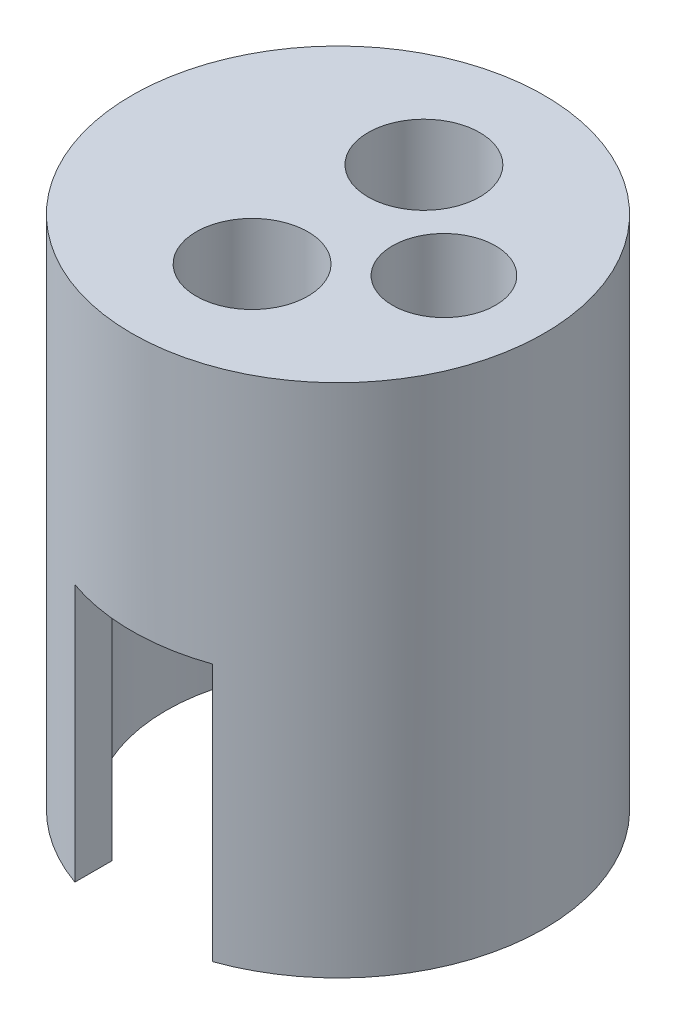
ISO-10303-21;
HEADER;
FILE_DESCRIPTION(('STEP AP214'),'2;1');
FILE_NAME('part.step','',(''),(''),'','','');
FILE_SCHEMA(('AUTOMOTIVE_DESIGN { 1 0 10303 214 1 1 1 1 }'));
ENDSEC;
DATA;
#1=APPLICATION_CONTEXT('core data for automotive mechanical design processes');
#2=APPLICATION_PROTOCOL_DEFINITION('international standard','automotive_design',2000,#1);
#3=PRODUCT_CONTEXT('',#1,'mechanical');
#4=PRODUCT('Part','Part','',(#3));
#5=PRODUCT_RELATED_PRODUCT_CATEGORY('part','',(#4));
#6=PRODUCT_DEFINITION_FORMATION('','',#4);
#7=PRODUCT_DEFINITION_CONTEXT('part definition',#1,'design');
#8=PRODUCT_DEFINITION('design','',#6,#7);
#9=PRODUCT_DEFINITION_SHAPE('','',#8);
#10=(LENGTH_UNIT() NAMED_UNIT(*) SI_UNIT(.MILLI.,.METRE.));
#11=(NAMED_UNIT(*) PLANE_ANGLE_UNIT() SI_UNIT($,.RADIAN.));
#12=(NAMED_UNIT(*) SI_UNIT($,.STERADIAN.) SOLID_ANGLE_UNIT());
#13=UNCERTAINTY_MEASURE_WITH_UNIT(LENGTH_MEASURE(1.E-05),#10,'distance_accuracy_value','');
#14=(GEOMETRIC_REPRESENTATION_CONTEXT(3) GLOBAL_UNCERTAINTY_ASSIGNED_CONTEXT((#13)) GLOBAL_UNIT_ASSIGNED_CONTEXT((#10,
#11,#12)) REPRESENTATION_CONTEXT('',''));
#15=CARTESIAN_POINT('',(0.,0.,0.));
#16=DIRECTION('',(0.,0.,1.));
#17=DIRECTION('',(1.,0.,0.));
#18=AXIS2_PLACEMENT_3D('',#15,#16,#17);
#19=CARTESIAN_POINT('',(17.2651571721263,15.,3.41654840670258));
#20=DIRECTION('',(0.,-1.,0.));
#21=DIRECTION('',(0.,0.,-1.));
#22=AXIS2_PLACEMENT_3D('',#19,#20,#21);
#23=CYLINDRICAL_SURFACE('',#22,1.25);
#24=CARTESIAN_POINT('',(17.2651571721263,2.5,3.41654840670258));
#25=DIRECTION('',(0.,-1.,0.));
#26=DIRECTION('',(0.,0.,-1.));
#27=AXIS2_PLACEMENT_3D('',#24,#25,#26);
#28=CIRCLE('',#27,1.25);
#29=CARTESIAN_POINT('',(17.2651571721263,2.5,2.16654840670258));
#30=VERTEX_POINT('',#29);
#31=EDGE_CURVE('E180',#30,#30,#28,.T.);
#32=ORIENTED_EDGE('',*,*,#31,.T.);
#33=EDGE_LOOP('',(#32));
#34=FACE_BOUND('',#33,.T.);
#35=CARTESIAN_POINT('',(17.2651571721263,8.,3.41654840670258));
#36=DIRECTION('',(0.,1.,0.));
#37=DIRECTION('',(0.,0.,1.));
#38=AXIS2_PLACEMENT_3D('',#35,#36,#37);
#39=CIRCLE('',#38,1.25);
#40=CARTESIAN_POINT('',(17.2651571721263,8.,4.66654840670258));
#41=VERTEX_POINT('',#40);
#42=EDGE_CURVE('E41',#41,#41,#39,.T.);
#43=ORIENTED_EDGE('',*,*,#42,.T.);
#44=EDGE_LOOP('',(#43));
#45=FACE_BOUND('',#44,.T.);
#46=ADVANCED_FACE('F37',(#34,#45),#23,.F.);
#47=CARTESIAN_POINT('',(17.2651571721263,15.,-6.58345159329742));
#48=DIRECTION('',(0.,-1.,0.));
#49=DIRECTION('',(0.,0.,-1.));
#50=AXIS2_PLACEMENT_3D('',#47,#48,#49);
#51=CYLINDRICAL_SURFACE('',#50,1.25);
#52=CARTESIAN_POINT('',(17.2651571721263,2.5,-6.58345159329742));
#53=DIRECTION('',(0.,-1.,0.));
#54=DIRECTION('',(0.,0.,-1.));
#55=AXIS2_PLACEMENT_3D('',#52,#53,#54);
#56=CIRCLE('',#55,1.25);
#57=CARTESIAN_POINT('',(17.2651571721263,2.5,-7.83345159329742));
#58=VERTEX_POINT('',#57);
#59=EDGE_CURVE('E137',#58,#58,#56,.T.);
#60=ORIENTED_EDGE('',*,*,#59,.T.);
#61=EDGE_LOOP('',(#60));
#62=FACE_BOUND('',#61,.T.);
#63=CARTESIAN_POINT('',(17.2651571721263,8.,-6.58345159329742));
#64=DIRECTION('',(0.,1.,0.));
#65=DIRECTION('',(0.,0.,1.));
#66=AXIS2_PLACEMENT_3D('',#63,#64,#65);
#67=CIRCLE('',#66,1.25);
#68=CARTESIAN_POINT('',(17.2651571721263,8.,-5.33345159329742));
#69=VERTEX_POINT('',#68);
#70=EDGE_CURVE('E188',#69,#69,#67,.T.);
#71=ORIENTED_EDGE('',*,*,#70,.T.);
#72=EDGE_LOOP('',(#71));
#73=FACE_BOUND('',#72,.T.);
#74=ADVANCED_FACE('F231',(#62,#73),#51,.F.);
#75=CARTESIAN_POINT('',(23.4320630022927,15.,-1.58345159329742));
#76=DIRECTION('',(0.,-1.,0.));
#77=DIRECTION('',(0.,0.,-1.));
#78=AXIS2_PLACEMENT_3D('',#75,#76,#77);
#79=CYLINDRICAL_SURFACE('',#78,3.);
#80=CARTESIAN_POINT('',(23.4320630022927,15.,-1.58345159329742));
#81=DIRECTION('',(0.,1.,0.));
#82=DIRECTION('',(0.,0.,1.));
#83=AXIS2_PLACEMENT_3D('',#80,#81,#82);
#84=CIRCLE('',#83,3.);
#85=CARTESIAN_POINT('',(23.4320630022927,15.,1.41654840670258));
#86=VERTEX_POINT('',#85);
#87=EDGE_CURVE('E11',#86,#86,#84,.T.);
#88=ORIENTED_EDGE('',*,*,#87,.T.);
#89=EDGE_LOOP('',(#88));
#90=FACE_BOUND('',#89,.T.);
#91=CARTESIAN_POINT('',(23.4320630022927,1.99999999999999,-1.58345159329742));
#92=DIRECTION('',(0.,-1.,0.));
#93=DIRECTION('',(0.,0.,-1.));
#94=AXIS2_PLACEMENT_3D('',#91,#92,#93);
#95=CIRCLE('',#94,3.);
#96=CARTESIAN_POINT('',(23.4320630022927,1.99999999999999,-4.58345159329742));
#97=VERTEX_POINT('',#96);
#98=EDGE_CURVE('E184',#97,#97,#95,.T.);
#99=ORIENTED_EDGE('',*,*,#98,.T.);
#100=EDGE_LOOP('',(#99));
#101=FACE_BOUND('',#100,.T.);
#102=ADVANCED_FACE('F222',(#90,#101),#79,.F.);
#103=CARTESIAN_POINT('',(0.,0.,0.));
#104=DIRECTION('',(0.,1.,0.));
#105=DIRECTION('',(0.,0.,1.));
#106=AXIS2_PLACEMENT_3D('',#103,#104,#105);
#107=PLANE('',#106);
#108=CARTESIAN_POINT('',(23.4320630022927,0.,-1.58345159329742));
#109=DIRECTION('',(0.,-1.,0.));
#110=DIRECTION('',(0.,0.,-1.));
#111=AXIS2_PLACEMENT_3D('',#108,#109,#110);
#112=CIRCLE('',#111,3.7);
#113=CARTESIAN_POINT('',(23.4320630022927,0.,-5.28345159329742));
#114=VERTEX_POINT('',#113);
#115=EDGE_CURVE('E190',#114,#114,#112,.T.);
#116=ORIENTED_EDGE('',*,*,#115,.F.);
#117=EDGE_LOOP('',(#116));
#118=FACE_BOUND('',#117,.T.);
#119=CARTESIAN_POINT('',(17.2651571721263,0.,3.41654840670258));
#120=DIRECTION('',(0.,-1.,0.));
#121=DIRECTION('',(0.,0.,-1.));
#122=AXIS2_PLACEMENT_3D('',#119,#120,#121);
#123=CIRCLE('',#122,2.25);
#124=CARTESIAN_POINT('',(17.2651571721263,0.,1.16654840670258));
#125=VERTEX_POINT('',#124);
#126=EDGE_CURVE('E186',#125,#125,#123,.T.);
#127=ORIENTED_EDGE('',*,*,#126,.F.);
#128=EDGE_LOOP('',(#127));
#129=FACE_BOUND('',#128,.T.);
#130=CARTESIAN_POINT('',(17.2651571721263,0.,-6.58345159329742));
#131=DIRECTION('',(0.,-1.,0.));
#132=DIRECTION('',(0.,0.,-1.));
#133=AXIS2_PLACEMENT_3D('',#130,#131,#132);
#134=CIRCLE('',#133,2.25);
#135=CARTESIAN_POINT('',(17.2651571721263,0.,-8.83345159329742));
#136=VERTEX_POINT('',#135);
#137=EDGE_CURVE('E130',#136,#136,#134,.T.);
#138=ORIENTED_EDGE('',*,*,#137,.F.);
#139=EDGE_LOOP('',(#138));
#140=FACE_BOUND('',#139,.T.);
#141=DIRECTION('',(0.,0.,-1.));
#142=VECTOR('',#141,1.);
#143=CARTESIAN_POINT('',(21.2651571721263,0.,0.));
#144=LINE('',#143,#142);
#145=CARTESIAN_POINT('',(21.2651571721263,0.,-10.7486029832091));
#146=VERTEX_POINT('',#145);
#147=CARTESIAN_POINT('',(21.2651571721263,0.,-12.8971600922822));
#148=VERTEX_POINT('',#147);
#149=EDGE_CURVE('E54',#146,#148,#144,.T.);
#150=ORIENTED_EDGE('',*,*,#149,.F.);
#151=CARTESIAN_POINT('',(17.2651571721263,0.,-1.58345159329742));
#152=DIRECTION('',(0.,-1.,0.));
#153=DIRECTION('',(0.,0.,-1.));
#154=AXIS2_PLACEMENT_3D('',#151,#152,#153);
#155=CIRCLE('',#154,10.);
#156=CARTESIAN_POINT('',(21.2651571721263,0.,7.58169979661426));
#157=VERTEX_POINT('',#156);
#158=EDGE_CURVE('E108',#146,#157,#155,.T.);
#159=ORIENTED_EDGE('',*,*,#158,.T.);
#160=DIRECTION('',(0.,0.,-1.));
#161=VECTOR('',#160,1.);
#162=CARTESIAN_POINT('',(21.2651571721263,0.,0.));
#163=LINE('',#162,#161);
#164=CARTESIAN_POINT('',(21.2651571721263,0.,9.73025690568734));
#165=VERTEX_POINT('',#164);
#166=EDGE_CURVE('E125',#165,#157,#163,.T.);
#167=ORIENTED_EDGE('',*,*,#166,.F.);
#168=CARTESIAN_POINT('',(17.2651571721263,0.,-1.58345159329742));
#169=DIRECTION('',(0.,1.,0.));
#170=DIRECTION('',(0.,0.,1.));
#171=AXIS2_PLACEMENT_3D('',#168,#169,#170);
#172=CIRCLE('',#171,12.);
#173=CARTESIAN_POINT('',(13.2651571721263,0.,9.73025690568734));
#174=VERTEX_POINT('',#173);
#175=EDGE_CURVE('E173',#174,#165,#172,.T.);
#176=ORIENTED_EDGE('',*,*,#175,.F.);
#177=DIRECTION('',(0.,0.,-1.));
#178=VECTOR('',#177,1.);
#179=CARTESIAN_POINT('',(13.2651571721263,0.,0.));
#180=LINE('',#179,#178);
#181=CARTESIAN_POINT('',(13.2651571721263,0.,7.58169979661426));
#182=VERTEX_POINT('',#181);
#183=EDGE_CURVE('E159',#174,#182,#180,.T.);
#184=ORIENTED_EDGE('',*,*,#183,.T.);
#185=CARTESIAN_POINT('',(17.2651571721263,0.,-1.58345159329742));
#186=DIRECTION('',(0.,-1.,0.));
#187=DIRECTION('',(0.,0.,-1.));
#188=AXIS2_PLACEMENT_3D('',#185,#186,#187);
#189=CIRCLE('',#188,9.99999999999999);
#190=CARTESIAN_POINT('',(13.2651571721263,0.,-10.7486029832091));
#191=VERTEX_POINT('',#190);
#192=EDGE_CURVE('E110',#182,#191,#189,.T.);
#193=ORIENTED_EDGE('',*,*,#192,.T.);
#194=DIRECTION('',(0.,0.,-1.));
#195=VECTOR('',#194,1.);
#196=CARTESIAN_POINT('',(13.2651571721263,0.,0.));
#197=LINE('',#196,#195);
#198=CARTESIAN_POINT('',(13.2651571721263,0.,-12.8971600922822));
#199=VERTEX_POINT('',#198);
#200=EDGE_CURVE('E148',#191,#199,#197,.T.);
#201=ORIENTED_EDGE('',*,*,#200,.T.);
#202=EDGE_CURVE('E59',#148,#199,#172,.T.);
#203=ORIENTED_EDGE('',*,*,#202,.F.);
#204=EDGE_LOOP('',(#150,#159,#167,#176,#184,#193,#201,#203));
#205=FACE_BOUND('',#204,.T.);
#206=ADVANCED_FACE('F220',(#118,#129,#140,#205),#107,.F.);
#207=CARTESIAN_POINT('',(17.2651571721263,15.,-1.58345159329742));
#208=DIRECTION('',(0.,-1.,0.));
#209=DIRECTION('',(0.,0.,-1.));
#210=AXIS2_PLACEMENT_3D('',#207,#208,#209);
#211=CYLINDRICAL_SURFACE('',#210,12.);
#212=CARTESIAN_POINT('',(17.2651571721263,15.,-1.58345159329742));
#213=DIRECTION('',(0.,1.,0.));
#214=DIRECTION('',(0.,0.,1.));
#215=AXIS2_PLACEMENT_3D('',#212,#213,#214);
#216=CIRCLE('',#215,12.);
#217=CARTESIAN_POINT('',(17.2651571721263,15.,10.4165484067026));
#218=VERTEX_POINT('',#217);
#219=EDGE_CURVE('E46',#218,#218,#216,.T.);
#220=ORIENTED_EDGE('',*,*,#219,.F.);
#221=EDGE_LOOP('',(#220));
#222=FACE_BOUND('',#221,.T.);
#223=ORIENTED_EDGE('',*,*,#175,.T.);
#224=DIRECTION('',(0.,1.,0.));
#225=VECTOR('',#224,1.);
#226=CARTESIAN_POINT('',(21.2651571721263,-15.,9.73025690568734));
#227=LINE('',#226,#225);
#228=CARTESIAN_POINT('',(21.2651571721263,-15.,9.73025690568734));
#229=VERTEX_POINT('',#228);
#230=EDGE_CURVE('E140',#229,#165,#227,.T.);
#231=ORIENTED_EDGE('',*,*,#230,.F.);
#232=CARTESIAN_POINT('',(17.2651571721263,-15.,-1.58345159329742));
#233=DIRECTION('',(0.,-1.,0.));
#234=DIRECTION('',(0.,0.,-1.));
#235=AXIS2_PLACEMENT_3D('',#232,#233,#234);
#236=CIRCLE('',#235,12.);
#237=CARTESIAN_POINT('',(21.2651571721263,-15.,-12.8971600922822));
#238=VERTEX_POINT('',#237);
#239=EDGE_CURVE('E119',#238,#229,#236,.T.);
#240=ORIENTED_EDGE('',*,*,#239,.F.);
#241=DIRECTION('',(0.,1.,0.));
#242=VECTOR('',#241,1.);
#243=CARTESIAN_POINT('',(21.2651571721263,-15.,-12.8971600922822));
#244=LINE('',#243,#242);
#245=EDGE_CURVE('E111',#238,#148,#244,.T.);
#246=ORIENTED_EDGE('',*,*,#245,.T.);
#247=ORIENTED_EDGE('',*,*,#202,.T.);
#248=DIRECTION('',(0.,1.,0.));
#249=VECTOR('',#248,1.);
#250=CARTESIAN_POINT('',(13.2651571721263,-15.,-12.8971600922822));
#251=LINE('',#250,#249);
#252=CARTESIAN_POINT('',(13.2651571721263,-15.,-12.8971600922822));
#253=VERTEX_POINT('',#252);
#254=EDGE_CURVE('E164',#253,#199,#251,.T.);
#255=ORIENTED_EDGE('',*,*,#254,.F.);
#256=CARTESIAN_POINT('',(17.2651571721263,-15.,-1.58345159329742));
#257=DIRECTION('',(0.,-1.,0.));
#258=DIRECTION('',(0.,0.,-1.));
#259=AXIS2_PLACEMENT_3D('',#256,#257,#258);
#260=CIRCLE('',#259,12.);
#261=CARTESIAN_POINT('',(13.2651571721263,-15.,9.73025690568734));
#262=VERTEX_POINT('',#261);
#263=EDGE_CURVE('E151',#262,#253,#260,.T.);
#264=ORIENTED_EDGE('',*,*,#263,.F.);
#265=DIRECTION('',(0.,1.,0.));
#266=VECTOR('',#265,1.);
#267=CARTESIAN_POINT('',(13.2651571721263,-15.,9.73025690568734));
#268=LINE('',#267,#266);
#269=EDGE_CURVE('E167',#262,#174,#268,.T.);
#270=ORIENTED_EDGE('',*,*,#269,.T.);
#271=EDGE_LOOP('',(#223,#231,#240,#246,#247,#255,#264,#270));
#272=FACE_BOUND('',#271,.T.);
#273=ADVANCED_FACE('F39',(#222,#272),#211,.T.);
#274=CARTESIAN_POINT('',(0.,15.,0.));
#275=DIRECTION('',(0.,1.,0.));
#276=DIRECTION('',(0.,0.,1.));
#277=AXIS2_PLACEMENT_3D('',#274,#275,#276);
#278=PLANE('',#277);
#279=CARTESIAN_POINT('',(17.2651571721263,15.,3.41654840670258));
#280=DIRECTION('',(0.,1.,0.));
#281=DIRECTION('',(0.,0.,1.));
#282=AXIS2_PLACEMENT_3D('',#279,#280,#281);
#283=CIRCLE('',#282,3.25);
#284=CARTESIAN_POINT('',(17.2651571721263,15.,6.66654840670258));
#285=VERTEX_POINT('',#284);
#286=EDGE_CURVE('E204',#285,#285,#283,.T.);
#287=ORIENTED_EDGE('',*,*,#286,.F.);
#288=EDGE_LOOP('',(#287));
#289=FACE_BOUND('',#288,.T.);
#290=CARTESIAN_POINT('',(17.2651571721263,15.,-6.58345159329742));
#291=DIRECTION('',(0.,1.,0.));
#292=DIRECTION('',(0.,0.,1.));
#293=AXIS2_PLACEMENT_3D('',#290,#291,#292);
#294=CIRCLE('',#293,3.25);
#295=CARTESIAN_POINT('',(17.2651571721263,15.,-3.33345159329742));
#296=VERTEX_POINT('',#295);
#297=EDGE_CURVE('E197',#296,#296,#294,.T.);
#298=ORIENTED_EDGE('',*,*,#297,.F.);
#299=EDGE_LOOP('',(#298));
#300=FACE_BOUND('',#299,.T.);
#301=ORIENTED_EDGE('',*,*,#219,.T.);
#302=EDGE_LOOP('',(#301));
#303=FACE_BOUND('',#302,.T.);
#304=ORIENTED_EDGE('',*,*,#87,.F.);
#305=EDGE_LOOP('',(#304));
#306=FACE_BOUND('',#305,.T.);
#307=ADVANCED_FACE('F229',(#289,#300,#303,#306),#278,.T.);
#308=CARTESIAN_POINT('',(17.2651571721263,-15.,-1.58345159329742));
#309=DIRECTION('',(0.,1.,0.));
#310=DIRECTION('',(0.,0.,1.));
#311=AXIS2_PLACEMENT_3D('',#308,#309,#310);
#312=CYLINDRICAL_SURFACE('',#311,9.99999999999999);
#313=ORIENTED_EDGE('',*,*,#192,.F.);
#314=DIRECTION('',(0.,1.,0.));
#315=VECTOR('',#314,1.);
#316=CARTESIAN_POINT('',(13.2651571721263,-15.,7.58169979661426));
#317=LINE('',#316,#315);
#318=CARTESIAN_POINT('',(13.2651571721263,-15.,7.58169979661426));
#319=VERTEX_POINT('',#318);
#320=EDGE_CURVE('E169',#319,#182,#317,.T.);
#321=ORIENTED_EDGE('',*,*,#320,.F.);
#322=CARTESIAN_POINT('',(17.2651571721263,-15.,-1.58345159329742));
#323=DIRECTION('',(0.,-1.,0.));
#324=DIRECTION('',(0.,0.,-1.));
#325=AXIS2_PLACEMENT_3D('',#322,#323,#324);
#326=CIRCLE('',#325,9.99999999999999);
#327=CARTESIAN_POINT('',(13.2651571721263,-15.,-10.7486029832091));
#328=VERTEX_POINT('',#327);
#329=EDGE_CURVE('E144',#319,#328,#326,.T.);
#330=ORIENTED_EDGE('',*,*,#329,.T.);
#331=DIRECTION('',(0.,1.,0.));
#332=VECTOR('',#331,1.);
#333=CARTESIAN_POINT('',(13.2651571721263,-15.,-10.7486029832091));
#334=LINE('',#333,#332);
#335=EDGE_CURVE('E156',#328,#191,#334,.T.);
#336=ORIENTED_EDGE('',*,*,#335,.T.);
#337=EDGE_LOOP('',(#313,#321,#330,#336));
#338=FACE_BOUND('',#337,.T.);
#339=ADVANCED_FACE('F260',(#338),#312,.F.);
#340=CARTESIAN_POINT('',(13.2651571721263,-15.,0.));
#341=DIRECTION('',(1.,0.,0.));
#342=DIRECTION('',(0.,0.,-1.));
#343=AXIS2_PLACEMENT_3D('',#340,#341,#342);
#344=PLANE('',#343);
#345=ORIENTED_EDGE('',*,*,#183,.F.);
#346=ORIENTED_EDGE('',*,*,#269,.F.);
#347=DIRECTION('',(0.,0.,-1.));
#348=VECTOR('',#347,1.);
#349=CARTESIAN_POINT('',(13.2651571721263,-15.,0.));
#350=LINE('',#349,#348);
#351=EDGE_CURVE('E147',#262,#319,#350,.T.);
#352=ORIENTED_EDGE('',*,*,#351,.T.);
#353=ORIENTED_EDGE('',*,*,#320,.T.);
#354=EDGE_LOOP('',(#345,#346,#352,#353));
#355=FACE_BOUND('',#354,.T.);
#356=ADVANCED_FACE('F316',(#355),#344,.T.);
#357=CARTESIAN_POINT('',(13.2651571721263,-15.,0.));
#358=DIRECTION('',(1.,0.,0.));
#359=DIRECTION('',(0.,0.,-1.));
#360=AXIS2_PLACEMENT_3D('',#357,#358,#359);
#361=PLANE('',#360);
#362=ORIENTED_EDGE('',*,*,#200,.F.);
#363=ORIENTED_EDGE('',*,*,#335,.F.);
#364=DIRECTION('',(0.,0.,-1.));
#365=VECTOR('',#364,1.);
#366=CARTESIAN_POINT('',(13.2651571721263,-15.,0.));
#367=LINE('',#366,#365);
#368=EDGE_CURVE('E153',#328,#253,#367,.T.);
#369=ORIENTED_EDGE('',*,*,#368,.T.);
#370=ORIENTED_EDGE('',*,*,#254,.T.);
#371=EDGE_LOOP('',(#362,#363,#369,#370));
#372=FACE_BOUND('',#371,.T.);
#373=ADVANCED_FACE('F312',(#372),#361,.T.);
#374=CARTESIAN_POINT('',(0.,-15.,0.));
#375=DIRECTION('',(0.,-1.,0.));
#376=DIRECTION('',(0.,0.,-1.));
#377=AXIS2_PLACEMENT_3D('',#374,#375,#376);
#378=PLANE('',#377);
#379=ORIENTED_EDGE('',*,*,#329,.F.);
#380=ORIENTED_EDGE('',*,*,#351,.F.);
#381=ORIENTED_EDGE('',*,*,#263,.T.);
#382=ORIENTED_EDGE('',*,*,#368,.F.);
#383=EDGE_LOOP('',(#379,#380,#381,#382));
#384=FACE_BOUND('',#383,.T.);
#385=ADVANCED_FACE('F309',(#384),#378,.T.);
#386=CARTESIAN_POINT('',(17.2651571721263,-15.,-1.58345159329742));
#387=DIRECTION('',(0.,1.,0.));
#388=DIRECTION('',(0.,0.,1.));
#389=AXIS2_PLACEMENT_3D('',#386,#387,#388);
#390=CYLINDRICAL_SURFACE('',#389,10.);
#391=ORIENTED_EDGE('',*,*,#158,.F.);
#392=DIRECTION('',(0.,1.,0.));
#393=VECTOR('',#392,1.);
#394=CARTESIAN_POINT('',(21.2651571721263,-15.,-10.7486029832091));
#395=LINE('',#394,#393);
#396=CARTESIAN_POINT('',(21.2651571721263,-15.,-10.7486029832091));
#397=VERTEX_POINT('',#396);
#398=EDGE_CURVE('E102',#397,#146,#395,.T.);
#399=ORIENTED_EDGE('',*,*,#398,.F.);
#400=CARTESIAN_POINT('',(17.2651571721263,-15.,-1.58345159329742));
#401=DIRECTION('',(0.,-1.,0.));
#402=DIRECTION('',(0.,0.,-1.));
#403=AXIS2_PLACEMENT_3D('',#400,#401,#402);
#404=CIRCLE('',#403,10.);
#405=CARTESIAN_POINT('',(21.2651571721263,-15.,7.58169979661426));
#406=VERTEX_POINT('',#405);
#407=EDGE_CURVE('E107',#397,#406,#404,.T.);
#408=ORIENTED_EDGE('',*,*,#407,.T.);
#409=DIRECTION('',(0.,1.,0.));
#410=VECTOR('',#409,1.);
#411=CARTESIAN_POINT('',(21.2651571721263,-15.,7.58169979661426));
#412=LINE('',#411,#410);
#413=EDGE_CURVE('E135',#406,#157,#412,.T.);
#414=ORIENTED_EDGE('',*,*,#413,.T.);
#415=EDGE_LOOP('',(#391,#399,#408,#414));
#416=FACE_BOUND('',#415,.T.);
#417=ADVANCED_FACE('F104',(#416),#390,.F.);
#418=CARTESIAN_POINT('',(21.2651571721263,-15.,0.));
#419=DIRECTION('',(1.,0.,0.));
#420=DIRECTION('',(0.,0.,-1.));
#421=AXIS2_PLACEMENT_3D('',#418,#419,#420);
#422=PLANE('',#421);
#423=ORIENTED_EDGE('',*,*,#149,.T.);
#424=ORIENTED_EDGE('',*,*,#245,.F.);
#425=DIRECTION('',(0.,0.,-1.));
#426=VECTOR('',#425,1.);
#427=CARTESIAN_POINT('',(21.2651571721263,-15.,0.));
#428=LINE('',#427,#426);
#429=EDGE_CURVE('E114',#397,#238,#428,.T.);
#430=ORIENTED_EDGE('',*,*,#429,.F.);
#431=ORIENTED_EDGE('',*,*,#398,.T.);
#432=EDGE_LOOP('',(#423,#424,#430,#431));
#433=FACE_BOUND('',#432,.T.);
#434=ADVANCED_FACE('F115',(#433),#422,.F.);
#435=CARTESIAN_POINT('',(21.2651571721263,-15.,0.));
#436=DIRECTION('',(1.,0.,0.));
#437=DIRECTION('',(0.,0.,-1.));
#438=AXIS2_PLACEMENT_3D('',#435,#436,#437);
#439=PLANE('',#438);
#440=ORIENTED_EDGE('',*,*,#166,.T.);
#441=ORIENTED_EDGE('',*,*,#413,.F.);
#442=DIRECTION('',(0.,0.,-1.));
#443=VECTOR('',#442,1.);
#444=CARTESIAN_POINT('',(21.2651571721263,-15.,0.));
#445=LINE('',#444,#443);
#446=EDGE_CURVE('E123',#229,#406,#445,.T.);
#447=ORIENTED_EDGE('',*,*,#446,.F.);
#448=ORIENTED_EDGE('',*,*,#230,.T.);
#449=EDGE_LOOP('',(#440,#441,#447,#448));
#450=FACE_BOUND('',#449,.T.);
#451=ADVANCED_FACE('F301',(#450),#439,.F.);
#452=CARTESIAN_POINT('',(0.,-15.,0.));
#453=DIRECTION('',(0.,-1.,0.));
#454=DIRECTION('',(0.,0.,-1.));
#455=AXIS2_PLACEMENT_3D('',#452,#453,#454);
#456=PLANE('',#455);
#457=ORIENTED_EDGE('',*,*,#407,.F.);
#458=ORIENTED_EDGE('',*,*,#429,.T.);
#459=ORIENTED_EDGE('',*,*,#239,.T.);
#460=ORIENTED_EDGE('',*,*,#446,.T.);
#461=EDGE_LOOP('',(#457,#458,#459,#460));
#462=FACE_BOUND('',#461,.T.);
#463=ADVANCED_FACE('F121',(#462),#456,.T.);
#464=CARTESIAN_POINT('',(17.2651571721263,2.5,-6.58345159329742));
#465=DIRECTION('',(0.,-1.,0.));
#466=DIRECTION('',(0.,0.,-1.));
#467=AXIS2_PLACEMENT_3D('',#464,#465,#466);
#468=CYLINDRICAL_SURFACE('',#467,2.25);
#469=CARTESIAN_POINT('',(17.2651571721263,2.5,-6.58345159329742));
#470=DIRECTION('',(0.,-1.,0.));
#471=DIRECTION('',(0.,0.,-1.));
#472=AXIS2_PLACEMENT_3D('',#469,#470,#471);
#473=CIRCLE('',#472,2.25);
#474=CARTESIAN_POINT('',(17.2651571721263,2.5,-8.83345159329742));
#475=VERTEX_POINT('',#474);
#476=EDGE_CURVE('E179',#475,#475,#473,.T.);
#477=ORIENTED_EDGE('',*,*,#476,.F.);
#478=EDGE_LOOP('',(#477));
#479=FACE_BOUND('',#478,.T.);
#480=ORIENTED_EDGE('',*,*,#137,.T.);
#481=EDGE_LOOP('',(#480));
#482=FACE_BOUND('',#481,.T.);
#483=ADVANCED_FACE('F218',(#479,#482),#468,.F.);
#484=CARTESIAN_POINT('',(17.2651571721263,2.5,-6.58345159329742));
#485=DIRECTION('',(0.,-1.,0.));
#486=DIRECTION('',(0.,0.,-1.));
#487=AXIS2_PLACEMENT_3D('',#484,#485,#486);
#488=PLANE('',#487);
#489=ORIENTED_EDGE('',*,*,#59,.F.);
#490=EDGE_LOOP('',(#489));
#491=FACE_BOUND('',#490,.T.);
#492=ORIENTED_EDGE('',*,*,#476,.T.);
#493=EDGE_LOOP('',(#492));
#494=FACE_BOUND('',#493,.T.);
#495=ADVANCED_FACE('F291',(#491,#494),#488,.T.);
#496=CARTESIAN_POINT('',(17.2651571721263,2.5,3.41654840670258));
#497=DIRECTION('',(0.,-1.,0.));
#498=DIRECTION('',(0.,0.,-1.));
#499=AXIS2_PLACEMENT_3D('',#496,#497,#498);
#500=CYLINDRICAL_SURFACE('',#499,2.25);
#501=CARTESIAN_POINT('',(17.2651571721263,2.5,3.41654840670258));
#502=DIRECTION('',(0.,-1.,0.));
#503=DIRECTION('',(0.,0.,-1.));
#504=AXIS2_PLACEMENT_3D('',#501,#502,#503);
#505=CIRCLE('',#504,2.25);
#506=CARTESIAN_POINT('',(17.2651571721263,2.5,1.16654840670258));
#507=VERTEX_POINT('',#506);
#508=EDGE_CURVE('E183',#507,#507,#505,.T.);
#509=ORIENTED_EDGE('',*,*,#508,.F.);
#510=EDGE_LOOP('',(#509));
#511=FACE_BOUND('',#510,.T.);
#512=ORIENTED_EDGE('',*,*,#126,.T.);
#513=EDGE_LOOP('',(#512));
#514=FACE_BOUND('',#513,.T.);
#515=ADVANCED_FACE('F284',(#511,#514),#500,.F.);
#516=CARTESIAN_POINT('',(17.2651571721263,2.5,3.41654840670258));
#517=DIRECTION('',(0.,-1.,0.));
#518=DIRECTION('',(0.,0.,-1.));
#519=AXIS2_PLACEMENT_3D('',#516,#517,#518);
#520=PLANE('',#519);
#521=ORIENTED_EDGE('',*,*,#31,.F.);
#522=EDGE_LOOP('',(#521));
#523=FACE_BOUND('',#522,.T.);
#524=ORIENTED_EDGE('',*,*,#508,.T.);
#525=EDGE_LOOP('',(#524));
#526=FACE_BOUND('',#525,.T.);
#527=ADVANCED_FACE('F279',(#523,#526),#520,.T.);
#528=CARTESIAN_POINT('',(23.4320630022927,1.99999999999999,-1.58345159329742));
#529=DIRECTION('',(0.,-1.,0.));
#530=DIRECTION('',(0.,0.,-1.));
#531=AXIS2_PLACEMENT_3D('',#528,#529,#530);
#532=CYLINDRICAL_SURFACE('',#531,3.7);
#533=CARTESIAN_POINT('',(23.4320630022927,1.99999999999999,-1.58345159329742));
#534=DIRECTION('',(0.,-1.,0.));
#535=DIRECTION('',(0.,0.,-1.));
#536=AXIS2_PLACEMENT_3D('',#533,#534,#535);
#537=CIRCLE('',#536,3.7);
#538=CARTESIAN_POINT('',(23.4320630022927,1.99999999999999,-5.28345159329742));
#539=VERTEX_POINT('',#538);
#540=EDGE_CURVE('E187',#539,#539,#537,.T.);
#541=ORIENTED_EDGE('',*,*,#540,.F.);
#542=EDGE_LOOP('',(#541));
#543=FACE_BOUND('',#542,.T.);
#544=ORIENTED_EDGE('',*,*,#115,.T.);
#545=EDGE_LOOP('',(#544));
#546=FACE_BOUND('',#545,.T.);
#547=ADVANCED_FACE('F273',(#543,#546),#532,.F.);
#548=CARTESIAN_POINT('',(23.4320630022927,1.99999999999999,-1.58345159329742));
#549=DIRECTION('',(0.,-1.,0.));
#550=DIRECTION('',(0.,0.,-1.));
#551=AXIS2_PLACEMENT_3D('',#548,#549,#550);
#552=PLANE('',#551);
#553=ORIENTED_EDGE('',*,*,#98,.F.);
#554=EDGE_LOOP('',(#553));
#555=FACE_BOUND('',#554,.T.);
#556=ORIENTED_EDGE('',*,*,#540,.T.);
#557=EDGE_LOOP('',(#556));
#558=FACE_BOUND('',#557,.T.);
#559=ADVANCED_FACE('F269',(#555,#558),#552,.T.);
#560=CARTESIAN_POINT('',(17.2651571721263,8.,-6.58345159329742));
#561=DIRECTION('',(0.,1.,0.));
#562=DIRECTION('',(0.,0.,1.));
#563=AXIS2_PLACEMENT_3D('',#560,#561,#562);
#564=CYLINDRICAL_SURFACE('',#563,3.25);
#565=CARTESIAN_POINT('',(17.2651571721263,8.,-6.58345159329742));
#566=DIRECTION('',(0.,1.,0.));
#567=DIRECTION('',(0.,0.,1.));
#568=AXIS2_PLACEMENT_3D('',#565,#566,#567);
#569=CIRCLE('',#568,3.25);
#570=CARTESIAN_POINT('',(17.2651571721263,8.,-3.33345159329742));
#571=VERTEX_POINT('',#570);
#572=EDGE_CURVE('E191',#571,#571,#569,.T.);
#573=ORIENTED_EDGE('',*,*,#572,.F.);
#574=EDGE_LOOP('',(#573));
#575=FACE_BOUND('',#574,.T.);
#576=ORIENTED_EDGE('',*,*,#297,.T.);
#577=EDGE_LOOP('',(#576));
#578=FACE_BOUND('',#577,.T.);
#579=ADVANCED_FACE('F272',(#575,#578),#564,.F.);
#580=CARTESIAN_POINT('',(17.2651571721263,8.,-6.58345159329742));
#581=DIRECTION('',(0.,1.,0.));
#582=DIRECTION('',(0.,0.,1.));
#583=AXIS2_PLACEMENT_3D('',#580,#581,#582);
#584=PLANE('',#583);
#585=ORIENTED_EDGE('',*,*,#70,.F.);
#586=EDGE_LOOP('',(#585));
#587=FACE_BOUND('',#586,.T.);
#588=ORIENTED_EDGE('',*,*,#572,.T.);
#589=EDGE_LOOP('',(#588));
#590=FACE_BOUND('',#589,.T.);
#591=ADVANCED_FACE('F419',(#587,#590),#584,.T.);
#592=CARTESIAN_POINT('',(17.2651571721263,8.,3.41654840670258));
#593=DIRECTION('',(0.,1.,0.));
#594=DIRECTION('',(0.,0.,1.));
#595=AXIS2_PLACEMENT_3D('',#592,#593,#594);
#596=CYLINDRICAL_SURFACE('',#595,3.25);
#597=CARTESIAN_POINT('',(17.2651571721263,8.,3.41654840670258));
#598=DIRECTION('',(0.,1.,0.));
#599=DIRECTION('',(0.,0.,1.));
#600=AXIS2_PLACEMENT_3D('',#597,#598,#599);
#601=CIRCLE('',#600,3.25);
#602=CARTESIAN_POINT('',(17.2651571721263,8.,6.66654840670258));
#603=VERTEX_POINT('',#602);
#604=EDGE_CURVE('E249',#603,#603,#601,.T.);
#605=ORIENTED_EDGE('',*,*,#604,.F.);
#606=EDGE_LOOP('',(#605));
#607=FACE_BOUND('',#606,.T.);
#608=ORIENTED_EDGE('',*,*,#286,.T.);
#609=EDGE_LOOP('',(#608));
#610=FACE_BOUND('',#609,.T.);
#611=ADVANCED_FACE('F256',(#607,#610),#596,.F.);
#612=CARTESIAN_POINT('',(17.2651571721263,8.,3.41654840670258));
#613=DIRECTION('',(0.,1.,0.));
#614=DIRECTION('',(0.,0.,1.));
#615=AXIS2_PLACEMENT_3D('',#612,#613,#614);
#616=PLANE('',#615);
#617=ORIENTED_EDGE('',*,*,#42,.F.);
#618=EDGE_LOOP('',(#617));
#619=FACE_BOUND('',#618,.T.);
#620=ORIENTED_EDGE('',*,*,#604,.T.);
#621=EDGE_LOOP('',(#620));
#622=FACE_BOUND('',#621,.T.);
#623=ADVANCED_FACE('F447',(#619,#622),#616,.T.);
#624=CLOSED_SHELL('',(#46,#74,#102,#206,#273,#307,#339,#356,#373,#385,#417,#434,#451,#463,#483,
#495,#515,#527,#547,#559,#579,#591,#611,#623));
#625=MANIFOLD_SOLID_BREP('B2',#624);
#626=ADVANCED_BREP_SHAPE_REPRESENTATION('',(#18,#625),#14);
#627=SHAPE_DEFINITION_REPRESENTATION(#9,#626);
ENDSEC;
END-ISO-10303-21;
